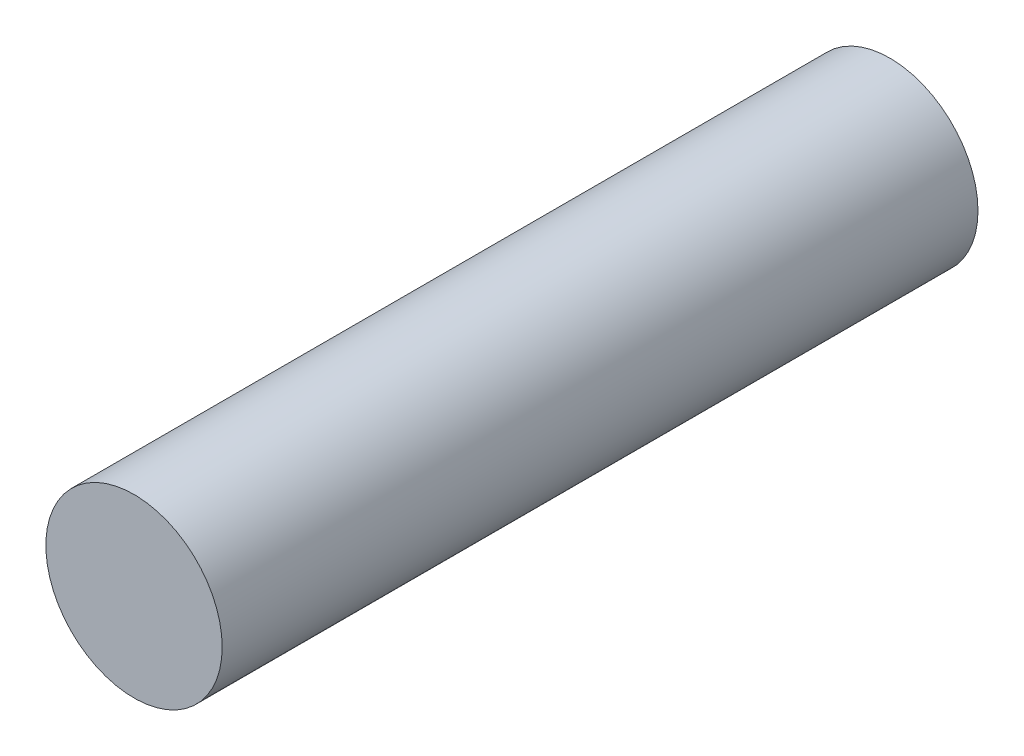
ISO-10303-21;
HEADER;
FILE_DESCRIPTION(('STEP AP214'),'2;1');
FILE_NAME('part.step','',(''),(''),'','','');
FILE_SCHEMA(('AUTOMOTIVE_DESIGN { 1 0 10303 214 1 1 1 1 }'));
ENDSEC;
DATA;
#1=APPLICATION_CONTEXT('core data for automotive mechanical design processes');
#2=APPLICATION_PROTOCOL_DEFINITION('international standard','automotive_design',2000,#1);
#3=PRODUCT_CONTEXT('',#1,'mechanical');
#4=PRODUCT('Part','Part','',(#3));
#5=PRODUCT_RELATED_PRODUCT_CATEGORY('part','',(#4));
#6=PRODUCT_DEFINITION_FORMATION('','',#4);
#7=PRODUCT_DEFINITION_CONTEXT('part definition',#1,'design');
#8=PRODUCT_DEFINITION('design','',#6,#7);
#9=PRODUCT_DEFINITION_SHAPE('','',#8);
#10=(LENGTH_UNIT() NAMED_UNIT(*) SI_UNIT(.MILLI.,.METRE.));
#11=(NAMED_UNIT(*) PLANE_ANGLE_UNIT() SI_UNIT($,.RADIAN.));
#12=(NAMED_UNIT(*) SI_UNIT($,.STERADIAN.) SOLID_ANGLE_UNIT());
#13=UNCERTAINTY_MEASURE_WITH_UNIT(LENGTH_MEASURE(1.E-05),#10,'distance_accuracy_value','');
#14=(GEOMETRIC_REPRESENTATION_CONTEXT(3) GLOBAL_UNCERTAINTY_ASSIGNED_CONTEXT((#13)) GLOBAL_UNIT_ASSIGNED_CONTEXT((#10,
#11,#12)) REPRESENTATION_CONTEXT('',''));
#15=CARTESIAN_POINT('',(0.,0.,0.));
#16=DIRECTION('',(0.,0.,1.));
#17=DIRECTION('',(1.,0.,0.));
#18=AXIS2_PLACEMENT_3D('',#15,#16,#17);
#19=CARTESIAN_POINT('',(0.,0.,15.));
#20=DIRECTION('',(0.,0.,-1.));
#21=DIRECTION('',(-1.,0.,0.));
#22=AXIS2_PLACEMENT_3D('',#19,#20,#21);
#23=CYLINDRICAL_SURFACE('',#22,1.75);
#24=CARTESIAN_POINT('',(0.,0.,15.));
#25=DIRECTION('',(0.,0.,1.));
#26=DIRECTION('',(1.,0.,0.));
#27=AXIS2_PLACEMENT_3D('',#24,#25,#26);
#28=CIRCLE('',#27,1.75);
#29=CARTESIAN_POINT('',(1.75,0.,15.));
#30=VERTEX_POINT('',#29);
#31=EDGE_CURVE('E10',#30,#30,#28,.T.);
#32=ORIENTED_EDGE('',*,*,#31,.F.);
#33=EDGE_LOOP('',(#32));
#34=FACE_BOUND('',#33,.T.);
#35=CARTESIAN_POINT('',(0.,0.,0.));
#36=DIRECTION('',(0.,0.,1.));
#37=DIRECTION('',(1.,0.,0.));
#38=AXIS2_PLACEMENT_3D('',#35,#36,#37);
#39=CIRCLE('',#38,1.75);
#40=CARTESIAN_POINT('',(1.75,0.,0.));
#41=VERTEX_POINT('',#40);
#42=EDGE_CURVE('E36',#41,#41,#39,.T.);
#43=ORIENTED_EDGE('',*,*,#42,.T.);
#44=EDGE_LOOP('',(#43));
#45=FACE_BOUND('',#44,.T.);
#46=ADVANCED_FACE('F33',(#34,#45),#23,.T.);
#47=CARTESIAN_POINT('',(0.,0.,15.));
#48=DIRECTION('',(0.,0.,1.));
#49=DIRECTION('',(1.,0.,0.));
#50=AXIS2_PLACEMENT_3D('',#47,#48,#49);
#51=PLANE('',#50);
#52=ORIENTED_EDGE('',*,*,#31,.T.);
#53=EDGE_LOOP('',(#52));
#54=FACE_BOUND('',#53,.T.);
#55=ADVANCED_FACE('F48',(#54),#51,.T.);
#56=CARTESIAN_POINT('',(0.,0.,0.));
#57=DIRECTION('',(0.,0.,1.));
#58=DIRECTION('',(1.,0.,0.));
#59=AXIS2_PLACEMENT_3D('',#56,#57,#58);
#60=PLANE('',#59);
#61=ORIENTED_EDGE('',*,*,#42,.F.);
#62=EDGE_LOOP('',(#61));
#63=FACE_BOUND('',#62,.T.);
#64=ADVANCED_FACE('F46',(#63),#60,.F.);
#65=CLOSED_SHELL('',(#46,#55,#64));
#66=MANIFOLD_SOLID_BREP('B2',#65);
#67=ADVANCED_BREP_SHAPE_REPRESENTATION('',(#18,#66),#14);
#68=SHAPE_DEFINITION_REPRESENTATION(#9,#67);
ENDSEC;
END-ISO-10303-21;
